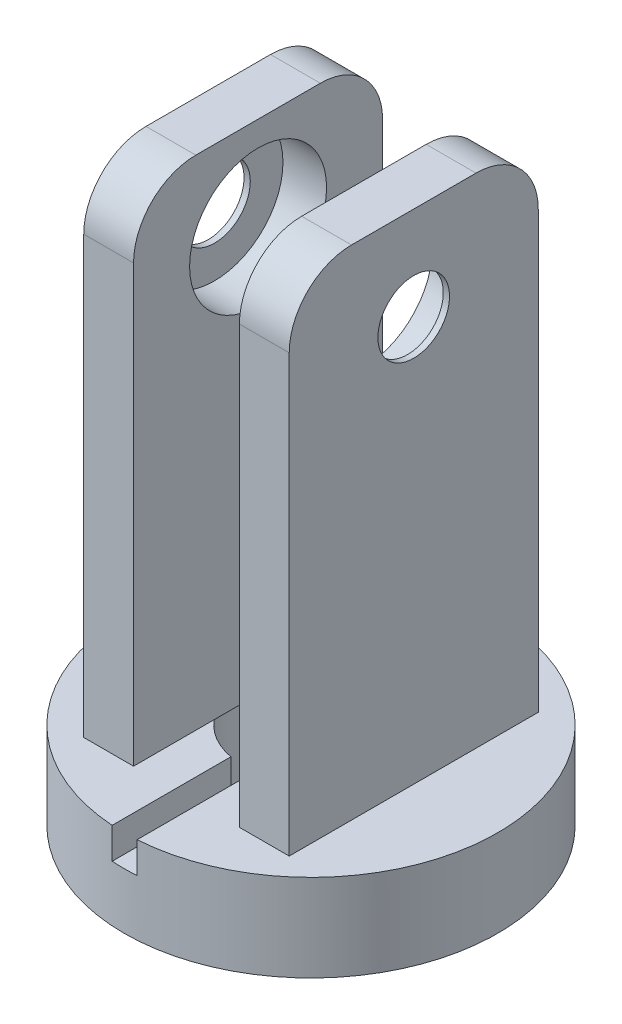
ISO-10303-21;
HEADER;
FILE_DESCRIPTION(('STEP AP214'),'2;1');
FILE_NAME('part.step','',(''),(''),'','','');
FILE_SCHEMA(('AUTOMOTIVE_DESIGN { 1 0 10303 214 1 1 1 1 }'));
ENDSEC;
DATA;
#1=APPLICATION_CONTEXT('core data for automotive mechanical design processes');
#2=APPLICATION_PROTOCOL_DEFINITION('international standard','automotive_design',2000,#1);
#3=PRODUCT_CONTEXT('',#1,'mechanical');
#4=PRODUCT('Part','Part','',(#3));
#5=PRODUCT_RELATED_PRODUCT_CATEGORY('part','',(#4));
#6=PRODUCT_DEFINITION_FORMATION('','',#4);
#7=PRODUCT_DEFINITION_CONTEXT('part definition',#1,'design');
#8=PRODUCT_DEFINITION('design','',#6,#7);
#9=PRODUCT_DEFINITION_SHAPE('','',#8);
#10=(LENGTH_UNIT() NAMED_UNIT(*) SI_UNIT(.MILLI.,.METRE.));
#11=(NAMED_UNIT(*) PLANE_ANGLE_UNIT() SI_UNIT($,.RADIAN.));
#12=(NAMED_UNIT(*) SI_UNIT($,.STERADIAN.) SOLID_ANGLE_UNIT());
#13=UNCERTAINTY_MEASURE_WITH_UNIT(LENGTH_MEASURE(1.E-05),#10,'distance_accuracy_value','');
#14=(GEOMETRIC_REPRESENTATION_CONTEXT(3) GLOBAL_UNCERTAINTY_ASSIGNED_CONTEXT((#13)) GLOBAL_UNIT_ASSIGNED_CONTEXT((#10,
#11,#12)) REPRESENTATION_CONTEXT('',''));
#15=CARTESIAN_POINT('',(0.,0.,0.));
#16=DIRECTION('',(0.,0.,1.));
#17=DIRECTION('',(1.,0.,0.));
#18=AXIS2_PLACEMENT_3D('',#15,#16,#17);
#19=CARTESIAN_POINT('',(0.,14.,0.));
#20=DIRECTION('',(0.,1.,0.));
#21=DIRECTION('',(0.,0.,1.));
#22=AXIS2_PLACEMENT_3D('',#19,#20,#21);
#23=PLANE('',#22);
#24=DIRECTION('',(0.,0.,-1.));
#25=VECTOR('',#24,1.);
#26=CARTESIAN_POINT('',(2.,14.,-29.9332590941915));
#27=LINE('',#26,#25);
#28=CARTESIAN_POINT('',(2.,14.,29.9332590941915));
#29=VERTEX_POINT('',#28);
#30=CARTESIAN_POINT('',(2.,14.,10.867497412008));
#31=VERTEX_POINT('',#30);
#32=EDGE_CURVE('E200',#29,#31,#27,.T.);
#33=ORIENTED_EDGE('',*,*,#32,.F.);
#34=CARTESIAN_POINT('',(0.,14.,0.));
#35=DIRECTION('',(0.,1.,0.));
#36=DIRECTION('',(0.,0.,1.));
#37=AXIS2_PLACEMENT_3D('',#34,#35,#36);
#38=CIRCLE('',#37,30.);
#39=CARTESIAN_POINT('',(2.,14.,-29.9332590941915));
#40=VERTEX_POINT('',#39);
#41=EDGE_CURVE('E282',#29,#40,#38,.T.);
#42=ORIENTED_EDGE('',*,*,#41,.T.);
#43=CARTESIAN_POINT('',(2.,14.,-10.867497412008));
#44=VERTEX_POINT('',#43);
#45=EDGE_CURVE('E354',#44,#40,#27,.T.);
#46=ORIENTED_EDGE('',*,*,#45,.F.);
#47=CARTESIAN_POINT('',(0.,14.,0.));
#48=DIRECTION('',(0.,-1.,0.));
#49=DIRECTION('',(0.,0.,-1.));
#50=AXIS2_PLACEMENT_3D('',#47,#48,#49);
#51=CIRCLE('',#50,11.05);
#52=CARTESIAN_POINT('',(8.5,14.,-7.06063028348037));
#53=VERTEX_POINT('',#52);
#54=EDGE_CURVE('E278',#44,#53,#51,.T.);
#55=ORIENTED_EDGE('',*,*,#54,.T.);
#56=DIRECTION('',(0.,0.,1.));
#57=VECTOR('',#56,1.);
#58=CARTESIAN_POINT('',(8.5,14.,-20.));
#59=LINE('',#58,#57);
#60=CARTESIAN_POINT('',(8.5,14.,-20.));
#61=VERTEX_POINT('',#60);
#62=EDGE_CURVE('E219',#61,#53,#59,.T.);
#63=ORIENTED_EDGE('',*,*,#62,.F.);
#64=DIRECTION('',(-1.,0.,0.));
#65=VECTOR('',#64,1.);
#66=CARTESIAN_POINT('',(16.5,14.,-20.));
#67=LINE('',#66,#65);
#68=CARTESIAN_POINT('',(16.5,14.,-20.));
#69=VERTEX_POINT('',#68);
#70=EDGE_CURVE('E230',#69,#61,#67,.T.);
#71=ORIENTED_EDGE('',*,*,#70,.F.);
#72=DIRECTION('',(0.,0.,-1.));
#73=VECTOR('',#72,1.);
#74=CARTESIAN_POINT('',(16.5,14.,20.));
#75=LINE('',#74,#73);
#76=CARTESIAN_POINT('',(16.5,14.,20.));
#77=VERTEX_POINT('',#76);
#78=EDGE_CURVE('E226',#77,#69,#75,.T.);
#79=ORIENTED_EDGE('',*,*,#78,.F.);
#80=DIRECTION('',(1.,0.,0.));
#81=VECTOR('',#80,1.);
#82=CARTESIAN_POINT('',(8.5,14.,20.));
#83=LINE('',#82,#81);
#84=CARTESIAN_POINT('',(8.5,14.,20.));
#85=VERTEX_POINT('',#84);
#86=EDGE_CURVE('E223',#85,#77,#83,.T.);
#87=ORIENTED_EDGE('',*,*,#86,.F.);
#88=CARTESIAN_POINT('',(8.5,14.,7.06063028348036));
#89=VERTEX_POINT('',#88);
#90=EDGE_CURVE('E233',#89,#85,#59,.T.);
#91=ORIENTED_EDGE('',*,*,#90,.F.);
#92=EDGE_CURVE('E366',#89,#31,#51,.T.);
#93=ORIENTED_EDGE('',*,*,#92,.T.);
#94=EDGE_LOOP('',(#33,#42,#46,#55,#63,#71,#79,#87,#91,#93));
#95=FACE_BOUND('',#94,.T.);
#96=ADVANCED_FACE('F34',(#95),#23,.T.);
#97=DIRECTION('',(0.,0.,1.));
#98=VECTOR('',#97,1.);
#99=CARTESIAN_POINT('',(-2.,14.,-29.9332590941915));
#100=LINE('',#99,#98);
#101=CARTESIAN_POINT('',(-2.,14.,-29.9332590941915));
#102=VERTEX_POINT('',#101);
#103=CARTESIAN_POINT('',(-2.,14.,-10.867497412008));
#104=VERTEX_POINT('',#103);
#105=EDGE_CURVE('E352',#102,#104,#100,.T.);
#106=ORIENTED_EDGE('',*,*,#105,.F.);
#107=CARTESIAN_POINT('',(-2.,14.,29.9332590941915));
#108=VERTEX_POINT('',#107);
#109=EDGE_CURVE('E207',#102,#108,#38,.T.);
#110=ORIENTED_EDGE('',*,*,#109,.T.);
#111=CARTESIAN_POINT('',(-2.,14.,10.867497412008));
#112=VERTEX_POINT('',#111);
#113=EDGE_CURVE('E339',#112,#108,#100,.T.);
#114=ORIENTED_EDGE('',*,*,#113,.F.);
#115=CARTESIAN_POINT('',(-8.5,14.,7.06063028348037));
#116=VERTEX_POINT('',#115);
#117=EDGE_CURVE('E281',#112,#116,#51,.T.);
#118=ORIENTED_EDGE('',*,*,#117,.T.);
#119=DIRECTION('',(0.,0.,-1.));
#120=VECTOR('',#119,1.);
#121=CARTESIAN_POINT('',(-8.5,14.,20.));
#122=LINE('',#121,#120);
#123=CARTESIAN_POINT('',(-8.5,14.,20.));
#124=VERTEX_POINT('',#123);
#125=EDGE_CURVE('E256',#124,#116,#122,.T.);
#126=ORIENTED_EDGE('',*,*,#125,.F.);
#127=DIRECTION('',(1.,0.,0.));
#128=VECTOR('',#127,1.);
#129=CARTESIAN_POINT('',(-16.5,14.,20.));
#130=LINE('',#129,#128);
#131=CARTESIAN_POINT('',(-16.5,14.,20.));
#132=VERTEX_POINT('',#131);
#133=EDGE_CURVE('E244',#132,#124,#130,.T.);
#134=ORIENTED_EDGE('',*,*,#133,.F.);
#135=DIRECTION('',(0.,0.,1.));
#136=VECTOR('',#135,1.);
#137=CARTESIAN_POINT('',(-16.5,14.,-20.));
#138=LINE('',#137,#136);
#139=CARTESIAN_POINT('',(-16.5,14.,-20.));
#140=VERTEX_POINT('',#139);
#141=EDGE_CURVE('E249',#140,#132,#138,.T.);
#142=ORIENTED_EDGE('',*,*,#141,.F.);
#143=DIRECTION('',(-1.,0.,0.));
#144=VECTOR('',#143,1.);
#145=CARTESIAN_POINT('',(-8.5,14.,-20.));
#146=LINE('',#145,#144);
#147=CARTESIAN_POINT('',(-8.5,14.,-20.));
#148=VERTEX_POINT('',#147);
#149=EDGE_CURVE('E259',#148,#140,#146,.T.);
#150=ORIENTED_EDGE('',*,*,#149,.F.);
#151=CARTESIAN_POINT('',(-8.5,14.,-7.06063028348037));
#152=VERTEX_POINT('',#151);
#153=EDGE_CURVE('E260',#152,#148,#122,.T.);
#154=ORIENTED_EDGE('',*,*,#153,.F.);
#155=EDGE_CURVE('E277',#152,#104,#51,.T.);
#156=ORIENTED_EDGE('',*,*,#155,.T.);
#157=EDGE_LOOP('',(#106,#110,#114,#118,#126,#134,#142,#150,#154,#156));
#158=FACE_BOUND('',#157,.T.);
#159=ADVANCED_FACE('F384',(#158),#23,.T.);
#160=CARTESIAN_POINT('',(0.,14.,0.));
#161=DIRECTION('',(0.,-1.,0.));
#162=DIRECTION('',(0.,0.,-1.));
#163=AXIS2_PLACEMENT_3D('',#160,#161,#162);
#164=CYLINDRICAL_SURFACE('',#163,30.);
#165=CARTESIAN_POINT('',(0.,9.,0.));
#166=DIRECTION('',(0.,1.,0.));
#167=DIRECTION('',(0.,0.,1.));
#168=AXIS2_PLACEMENT_3D('',#165,#166,#167);
#169=CIRCLE('',#168,30.);
#170=CARTESIAN_POINT('',(2.,9.,-29.9332590941915));
#171=VERTEX_POINT('',#170);
#172=CARTESIAN_POINT('',(-2.,9.,-29.9332590941915));
#173=VERTEX_POINT('',#172);
#174=EDGE_CURVE('E193',#171,#173,#169,.T.);
#175=ORIENTED_EDGE('',*,*,#174,.F.);
#176=DIRECTION('',(0.,1.,0.));
#177=VECTOR('',#176,1.);
#178=CARTESIAN_POINT('',(2.,9.,-29.9332590941915));
#179=LINE('',#178,#177);
#180=EDGE_CURVE('E227',#171,#40,#179,.T.);
#181=ORIENTED_EDGE('',*,*,#180,.T.);
#182=ORIENTED_EDGE('',*,*,#41,.F.);
#183=DIRECTION('',(0.,1.,0.));
#184=VECTOR('',#183,1.);
#185=CARTESIAN_POINT('',(2.,9.,29.9332590941915));
#186=LINE('',#185,#184);
#187=CARTESIAN_POINT('',(2.,9.,29.9332590941915));
#188=VERTEX_POINT('',#187);
#189=EDGE_CURVE('E210',#188,#29,#186,.T.);
#190=ORIENTED_EDGE('',*,*,#189,.F.);
#191=CARTESIAN_POINT('',(0.,9.,0.));
#192=DIRECTION('',(0.,1.,0.));
#193=DIRECTION('',(0.,0.,1.));
#194=AXIS2_PLACEMENT_3D('',#191,#192,#193);
#195=CIRCLE('',#194,30.);
#196=CARTESIAN_POINT('',(-2.,9.,29.9332590941915));
#197=VERTEX_POINT('',#196);
#198=EDGE_CURVE('E189',#197,#188,#195,.T.);
#199=ORIENTED_EDGE('',*,*,#198,.F.);
#200=DIRECTION('',(0.,1.,0.));
#201=VECTOR('',#200,1.);
#202=CARTESIAN_POINT('',(-2.,9.,29.9332590941915));
#203=LINE('',#202,#201);
#204=EDGE_CURVE('E208',#197,#108,#203,.T.);
#205=ORIENTED_EDGE('',*,*,#204,.T.);
#206=ORIENTED_EDGE('',*,*,#109,.F.);
#207=DIRECTION('',(0.,1.,0.));
#208=VECTOR('',#207,1.);
#209=CARTESIAN_POINT('',(-2.,9.,-29.9332590941915));
#210=LINE('',#209,#208);
#211=EDGE_CURVE('E185',#173,#102,#210,.T.);
#212=ORIENTED_EDGE('',*,*,#211,.F.);
#213=EDGE_LOOP('',(#175,#181,#182,#190,#199,#205,#206,#212));
#214=FACE_BOUND('',#213,.T.);
#215=CARTESIAN_POINT('',(0.,0.,0.));
#216=DIRECTION('',(0.,1.,0.));
#217=DIRECTION('',(0.,0.,1.));
#218=AXIS2_PLACEMENT_3D('',#215,#216,#217);
#219=CIRCLE('',#218,30.);
#220=CARTESIAN_POINT('',(0.,0.,30.));
#221=VERTEX_POINT('',#220);
#222=EDGE_CURVE('E276',#221,#221,#219,.T.);
#223=ORIENTED_EDGE('',*,*,#222,.T.);
#224=EDGE_LOOP('',(#223));
#225=FACE_BOUND('',#224,.T.);
#226=ADVANCED_FACE('F203',(#214,#225),#164,.T.);
#227=CARTESIAN_POINT('',(0.,0.,0.));
#228=DIRECTION('',(0.,1.,0.));
#229=DIRECTION('',(0.,0.,1.));
#230=AXIS2_PLACEMENT_3D('',#227,#228,#229);
#231=PLANE('',#230);
#232=CARTESIAN_POINT('',(0.,0.,0.));
#233=DIRECTION('',(0.,-1.,0.));
#234=DIRECTION('',(0.,0.,-1.));
#235=AXIS2_PLACEMENT_3D('',#232,#233,#234);
#236=CIRCLE('',#235,11.05);
#237=CARTESIAN_POINT('',(0.,0.,-11.05));
#238=VERTEX_POINT('',#237);
#239=EDGE_CURVE('E272',#238,#238,#236,.T.);
#240=ORIENTED_EDGE('',*,*,#239,.F.);
#241=EDGE_LOOP('',(#240));
#242=FACE_BOUND('',#241,.T.);
#243=ORIENTED_EDGE('',*,*,#222,.F.);
#244=EDGE_LOOP('',(#243));
#245=FACE_BOUND('',#244,.T.);
#246=ADVANCED_FACE('F437',(#242,#245),#231,.F.);
#247=CARTESIAN_POINT('',(0.,14.,0.));
#248=DIRECTION('',(0.,-1.,0.));
#249=DIRECTION('',(0.,0.,-1.));
#250=AXIS2_PLACEMENT_3D('',#247,#248,#249);
#251=CYLINDRICAL_SURFACE('',#250,11.05);
#252=ORIENTED_EDGE('',*,*,#54,.F.);
#253=DIRECTION('',(0.,-1.,0.));
#254=VECTOR('',#253,1.);
#255=CARTESIAN_POINT('',(2.,14.,-10.867497412008));
#256=LINE('',#255,#254);
#257=CARTESIAN_POINT('',(2.,9.,-10.867497412008));
#258=VERTEX_POINT('',#257);
#259=EDGE_CURVE('E12',#44,#258,#256,.T.);
#260=ORIENTED_EDGE('',*,*,#259,.T.);
#261=CARTESIAN_POINT('',(0.,9.,0.));
#262=DIRECTION('',(0.,1.,0.));
#263=DIRECTION('',(0.,0.,1.));
#264=AXIS2_PLACEMENT_3D('',#261,#262,#263);
#265=CIRCLE('',#264,11.05);
#266=CARTESIAN_POINT('',(-2.,9.,-10.867497412008));
#267=VERTEX_POINT('',#266);
#268=EDGE_CURVE('E326',#267,#258,#265,.F.);
#269=ORIENTED_EDGE('',*,*,#268,.F.);
#270=DIRECTION('',(0.,-1.,0.));
#271=VECTOR('',#270,1.);
#272=CARTESIAN_POINT('',(-2.,14.,-10.867497412008));
#273=LINE('',#272,#271);
#274=EDGE_CURVE('E43',#267,#104,#273,.F.);
#275=ORIENTED_EDGE('',*,*,#274,.T.);
#276=ORIENTED_EDGE('',*,*,#155,.F.);
#277=EDGE_CURVE('E273',#116,#152,#51,.T.);
#278=ORIENTED_EDGE('',*,*,#277,.F.);
#279=ORIENTED_EDGE('',*,*,#117,.F.);
#280=DIRECTION('',(0.,-1.,0.));
#281=VECTOR('',#280,1.);
#282=CARTESIAN_POINT('',(-2.,14.,10.867497412008));
#283=LINE('',#282,#281);
#284=CARTESIAN_POINT('',(-2.,9.,10.867497412008));
#285=VERTEX_POINT('',#284);
#286=EDGE_CURVE('E325',#112,#285,#283,.T.);
#287=ORIENTED_EDGE('',*,*,#286,.T.);
#288=CARTESIAN_POINT('',(2.,9.,10.867497412008));
#289=VERTEX_POINT('',#288);
#290=EDGE_CURVE('E323',#289,#285,#265,.F.);
#291=ORIENTED_EDGE('',*,*,#290,.F.);
#292=DIRECTION('',(0.,-1.,0.));
#293=VECTOR('',#292,1.);
#294=CARTESIAN_POINT('',(2.,14.,10.867497412008));
#295=LINE('',#294,#293);
#296=EDGE_CURVE('E329',#289,#31,#295,.F.);
#297=ORIENTED_EDGE('',*,*,#296,.T.);
#298=ORIENTED_EDGE('',*,*,#92,.F.);
#299=EDGE_CURVE('E376',#53,#89,#51,.T.);
#300=ORIENTED_EDGE('',*,*,#299,.F.);
#301=EDGE_LOOP('',(#252,#260,#269,#275,#276,#278,#279,#287,#291,#297,#298,#300));
#302=FACE_BOUND('',#301,.T.);
#303=ORIENTED_EDGE('',*,*,#239,.T.);
#304=EDGE_LOOP('',(#303));
#305=FACE_BOUND('',#304,.T.);
#306=ADVANCED_FACE('F373',(#302,#305),#251,.F.);
#307=CARTESIAN_POINT('',(0.,14.,0.));
#308=DIRECTION('',(0.,1.,0.));
#309=DIRECTION('',(0.,0.,1.));
#310=AXIS2_PLACEMENT_3D('',#307,#308,#309);
#311=PLANE('',#310);
#312=EDGE_CURVE('E255',#116,#152,#122,.T.);
#313=ORIENTED_EDGE('',*,*,#312,.F.);
#314=ORIENTED_EDGE('',*,*,#277,.T.);
#315=EDGE_LOOP('',(#313,#314));
#316=FACE_BOUND('',#315,.T.);
#317=ADVANCED_FACE('F390',(#316),#311,.F.);
#318=CARTESIAN_POINT('',(-16.5,94.,20.));
#319=DIRECTION('',(0.,0.,-1.));
#320=DIRECTION('',(-1.,0.,0.));
#321=AXIS2_PLACEMENT_3D('',#318,#319,#320);
#322=PLANE('',#321);
#323=DIRECTION('',(0.,-1.,0.));
#324=VECTOR('',#323,1.);
#325=CARTESIAN_POINT('',(-8.5,94.,20.));
#326=LINE('',#325,#324);
#327=CARTESIAN_POINT('',(-8.5,84.,20.));
#328=VERTEX_POINT('',#327);
#329=EDGE_CURVE('E270',#328,#124,#326,.T.);
#330=ORIENTED_EDGE('',*,*,#329,.F.);
#331=DIRECTION('',(1.,0.,0.));
#332=VECTOR('',#331,1.);
#333=CARTESIAN_POINT('',(-16.5,84.,20.));
#334=LINE('',#333,#332);
#335=CARTESIAN_POINT('',(-16.5,84.,20.));
#336=VERTEX_POINT('',#335);
#337=EDGE_CURVE('E321',#328,#336,#334,.F.);
#338=ORIENTED_EDGE('',*,*,#337,.T.);
#339=DIRECTION('',(0.,-1.,0.));
#340=VECTOR('',#339,1.);
#341=CARTESIAN_POINT('',(-16.5,94.,20.));
#342=LINE('',#341,#340);
#343=EDGE_CURVE('E252',#336,#132,#342,.T.);
#344=ORIENTED_EDGE('',*,*,#343,.T.);
#345=ORIENTED_EDGE('',*,*,#133,.T.);
#346=EDGE_LOOP('',(#330,#338,#344,#345));
#347=FACE_BOUND('',#346,.T.);
#348=ADVANCED_FACE('F399',(#347),#322,.F.);
#349=CARTESIAN_POINT('',(-8.5,94.,20.));
#350=DIRECTION('',(-1.,0.,0.));
#351=DIRECTION('',(0.,0.,1.));
#352=AXIS2_PLACEMENT_3D('',#349,#350,#351);
#353=PLANE('',#352);
#354=CARTESIAN_POINT('',(-8.5,79.,0.));
#355=DIRECTION('',(-1.,0.,0.));
#356=DIRECTION('',(0.,0.,1.));
#357=AXIS2_PLACEMENT_3D('',#354,#355,#356);
#358=CIRCLE('',#357,11.);
#359=CARTESIAN_POINT('',(-8.5,79.,11.));
#360=VERTEX_POINT('',#359);
#361=EDGE_CURVE('E334',#360,#360,#358,.T.);
#362=ORIENTED_EDGE('',*,*,#361,.T.);
#363=EDGE_LOOP('',(#362));
#364=FACE_BOUND('',#363,.T.);
#365=DIRECTION('',(0.,-1.,0.));
#366=VECTOR('',#365,1.);
#367=CARTESIAN_POINT('',(-8.5,94.,-20.));
#368=LINE('',#367,#366);
#369=CARTESIAN_POINT('',(-8.5,84.,-20.));
#370=VERTEX_POINT('',#369);
#371=EDGE_CURVE('E268',#370,#148,#368,.T.);
#372=ORIENTED_EDGE('',*,*,#371,.F.);
#373=CARTESIAN_POINT('',(-8.5,84.,-10.));
#374=DIRECTION('',(-1.,0.,0.));
#375=DIRECTION('',(0.,0.,1.));
#376=AXIS2_PLACEMENT_3D('',#373,#374,#375);
#377=CIRCLE('',#376,10.);
#378=CARTESIAN_POINT('',(-8.5,94.,-10.));
#379=VERTEX_POINT('',#378);
#380=EDGE_CURVE('E301',#370,#379,#377,.F.);
#381=ORIENTED_EDGE('',*,*,#380,.T.);
#382=DIRECTION('',(0.,0.,-1.));
#383=VECTOR('',#382,1.);
#384=CARTESIAN_POINT('',(-8.5,94.,20.));
#385=LINE('',#384,#383);
#386=CARTESIAN_POINT('',(-8.5,94.,10.));
#387=VERTEX_POINT('',#386);
#388=EDGE_CURVE('E245',#387,#379,#385,.T.);
#389=ORIENTED_EDGE('',*,*,#388,.F.);
#390=CARTESIAN_POINT('',(-8.5,84.,10.));
#391=DIRECTION('',(-1.,0.,0.));
#392=DIRECTION('',(0.,0.,1.));
#393=AXIS2_PLACEMENT_3D('',#390,#391,#392);
#394=CIRCLE('',#393,10.);
#395=EDGE_CURVE('E299',#387,#328,#394,.F.);
#396=ORIENTED_EDGE('',*,*,#395,.T.);
#397=ORIENTED_EDGE('',*,*,#329,.T.);
#398=ORIENTED_EDGE('',*,*,#125,.T.);
#399=ORIENTED_EDGE('',*,*,#312,.T.);
#400=ORIENTED_EDGE('',*,*,#153,.T.);
#401=EDGE_LOOP('',(#372,#381,#389,#396,#397,#398,#399,#400));
#402=FACE_BOUND('',#401,.T.);
#403=ADVANCED_FACE('F394',(#364,#402),#353,.F.);
#404=CARTESIAN_POINT('',(-8.5,94.,-20.));
#405=DIRECTION('',(0.,0.,1.));
#406=DIRECTION('',(1.,0.,0.));
#407=AXIS2_PLACEMENT_3D('',#404,#405,#406);
#408=PLANE('',#407);
#409=DIRECTION('',(0.,-1.,0.));
#410=VECTOR('',#409,1.);
#411=CARTESIAN_POINT('',(-16.5,94.,-20.));
#412=LINE('',#411,#410);
#413=CARTESIAN_POINT('',(-16.5,84.,-20.));
#414=VERTEX_POINT('',#413);
#415=EDGE_CURVE('E266',#414,#140,#412,.T.);
#416=ORIENTED_EDGE('',*,*,#415,.F.);
#417=DIRECTION('',(-1.,0.,0.));
#418=VECTOR('',#417,1.);
#419=CARTESIAN_POINT('',(-8.5,84.,-20.));
#420=LINE('',#419,#418);
#421=EDGE_CURVE('E297',#414,#370,#420,.F.);
#422=ORIENTED_EDGE('',*,*,#421,.T.);
#423=ORIENTED_EDGE('',*,*,#371,.T.);
#424=ORIENTED_EDGE('',*,*,#149,.T.);
#425=EDGE_LOOP('',(#416,#422,#423,#424));
#426=FACE_BOUND('',#425,.T.);
#427=ADVANCED_FACE('F417',(#426),#408,.F.);
#428=CARTESIAN_POINT('',(-16.5,94.,-20.));
#429=DIRECTION('',(1.,0.,0.));
#430=DIRECTION('',(0.,0.,-1.));
#431=AXIS2_PLACEMENT_3D('',#428,#429,#430);
#432=PLANE('',#431);
#433=CARTESIAN_POINT('',(-16.5,79.,0.));
#434=DIRECTION('',(-1.,0.,0.));
#435=DIRECTION('',(0.,0.,1.));
#436=AXIS2_PLACEMENT_3D('',#433,#434,#435);
#437=CIRCLE('',#436,5.75);
#438=CARTESIAN_POINT('',(-16.5,79.,5.75));
#439=VERTEX_POINT('',#438);
#440=EDGE_CURVE('E730',#439,#439,#437,.T.);
#441=ORIENTED_EDGE('',*,*,#440,.F.);
#442=EDGE_LOOP('',(#441));
#443=FACE_BOUND('',#442,.T.);
#444=DIRECTION('',(0.,0.,1.));
#445=VECTOR('',#444,1.);
#446=CARTESIAN_POINT('',(-16.5,94.,-20.));
#447=LINE('',#446,#445);
#448=CARTESIAN_POINT('',(-16.5,94.,-10.));
#449=VERTEX_POINT('',#448);
#450=CARTESIAN_POINT('',(-16.5,94.,10.));
#451=VERTEX_POINT('',#450);
#452=EDGE_CURVE('E248',#449,#451,#447,.T.);
#453=ORIENTED_EDGE('',*,*,#452,.F.);
#454=CARTESIAN_POINT('',(-16.5,84.,-10.));
#455=DIRECTION('',(1.,0.,0.));
#456=DIRECTION('',(0.,0.,-1.));
#457=AXIS2_PLACEMENT_3D('',#454,#455,#456);
#458=CIRCLE('',#457,10.);
#459=EDGE_CURVE('E295',#449,#414,#458,.F.);
#460=ORIENTED_EDGE('',*,*,#459,.T.);
#461=ORIENTED_EDGE('',*,*,#415,.T.);
#462=ORIENTED_EDGE('',*,*,#141,.T.);
#463=ORIENTED_EDGE('',*,*,#343,.F.);
#464=CARTESIAN_POINT('',(-16.5,84.,10.));
#465=DIRECTION('',(1.,0.,0.));
#466=DIRECTION('',(0.,0.,-1.));
#467=AXIS2_PLACEMENT_3D('',#464,#465,#466);
#468=CIRCLE('',#467,10.);
#469=EDGE_CURVE('E293',#336,#451,#468,.F.);
#470=ORIENTED_EDGE('',*,*,#469,.T.);
#471=EDGE_LOOP('',(#453,#460,#461,#462,#463,#470));
#472=FACE_BOUND('',#471,.T.);
#473=ADVANCED_FACE('F406',(#443,#472),#432,.F.);
#474=CARTESIAN_POINT('',(0.,94.,0.));
#475=DIRECTION('',(0.,1.,0.));
#476=DIRECTION('',(0.,0.,1.));
#477=AXIS2_PLACEMENT_3D('',#474,#475,#476);
#478=PLANE('',#477);
#479=ORIENTED_EDGE('',*,*,#388,.T.);
#480=DIRECTION('',(-1.,0.,0.));
#481=VECTOR('',#480,1.);
#482=CARTESIAN_POINT('',(-16.5,94.,-10.));
#483=LINE('',#482,#481);
#484=EDGE_CURVE('E290',#379,#449,#483,.T.);
#485=ORIENTED_EDGE('',*,*,#484,.T.);
#486=ORIENTED_EDGE('',*,*,#452,.T.);
#487=DIRECTION('',(1.,0.,0.));
#488=VECTOR('',#487,1.);
#489=CARTESIAN_POINT('',(-8.5,94.,10.));
#490=LINE('',#489,#488);
#491=EDGE_CURVE('E287',#451,#387,#490,.T.);
#492=ORIENTED_EDGE('',*,*,#491,.T.);
#493=EDGE_LOOP('',(#479,#485,#486,#492));
#494=FACE_BOUND('',#493,.T.);
#495=ADVANCED_FACE('F408',(#494),#478,.T.);
#496=CARTESIAN_POINT('',(0.,14.,0.));
#497=DIRECTION('',(0.,1.,0.));
#498=DIRECTION('',(0.,0.,1.));
#499=AXIS2_PLACEMENT_3D('',#496,#497,#498);
#500=PLANE('',#499);
#501=EDGE_CURVE('E236',#53,#89,#59,.T.);
#502=ORIENTED_EDGE('',*,*,#501,.F.);
#503=ORIENTED_EDGE('',*,*,#299,.T.);
#504=EDGE_LOOP('',(#502,#503));
#505=FACE_BOUND('',#504,.T.);
#506=ADVANCED_FACE('F483',(#505),#500,.F.);
#507=CARTESIAN_POINT('',(8.5,94.,20.));
#508=DIRECTION('',(0.,0.,-1.));
#509=DIRECTION('',(-1.,0.,0.));
#510=AXIS2_PLACEMENT_3D('',#507,#508,#509);
#511=PLANE('',#510);
#512=DIRECTION('',(0.,-1.,0.));
#513=VECTOR('',#512,1.);
#514=CARTESIAN_POINT('',(16.5,94.,20.));
#515=LINE('',#514,#513);
#516=CARTESIAN_POINT('',(16.5,84.,20.));
#517=VERTEX_POINT('',#516);
#518=EDGE_CURVE('E242',#517,#77,#515,.T.);
#519=ORIENTED_EDGE('',*,*,#518,.F.);
#520=DIRECTION('',(1.,0.,0.));
#521=VECTOR('',#520,1.);
#522=CARTESIAN_POINT('',(8.5,84.,20.));
#523=LINE('',#522,#521);
#524=CARTESIAN_POINT('',(8.5,84.,20.));
#525=VERTEX_POINT('',#524);
#526=EDGE_CURVE('E319',#517,#525,#523,.F.);
#527=ORIENTED_EDGE('',*,*,#526,.T.);
#528=DIRECTION('',(0.,-1.,0.));
#529=VECTOR('',#528,1.);
#530=CARTESIAN_POINT('',(8.5,94.,20.));
#531=LINE('',#530,#529);
#532=EDGE_CURVE('E222',#525,#85,#531,.T.);
#533=ORIENTED_EDGE('',*,*,#532,.T.);
#534=ORIENTED_EDGE('',*,*,#86,.T.);
#535=EDGE_LOOP('',(#519,#527,#533,#534));
#536=FACE_BOUND('',#535,.T.);
#537=ADVANCED_FACE('F480',(#536),#511,.F.);
#538=CARTESIAN_POINT('',(16.5,94.,20.));
#539=DIRECTION('',(-1.,0.,0.));
#540=DIRECTION('',(0.,0.,1.));
#541=AXIS2_PLACEMENT_3D('',#538,#539,#540);
#542=PLANE('',#541);
#543=CARTESIAN_POINT('',(16.5,79.,0.));
#544=DIRECTION('',(-1.,0.,0.));
#545=DIRECTION('',(0.,0.,1.));
#546=AXIS2_PLACEMENT_3D('',#543,#544,#545);
#547=CIRCLE('',#546,5.75);
#548=CARTESIAN_POINT('',(16.5,79.,5.75));
#549=VERTEX_POINT('',#548);
#550=EDGE_CURVE('E729',#549,#549,#547,.F.);
#551=ORIENTED_EDGE('',*,*,#550,.F.);
#552=EDGE_LOOP('',(#551));
#553=FACE_BOUND('',#552,.T.);
#554=DIRECTION('',(0.,-1.,0.));
#555=VECTOR('',#554,1.);
#556=CARTESIAN_POINT('',(16.5,94.,-20.));
#557=LINE('',#556,#555);
#558=CARTESIAN_POINT('',(16.5,84.,-20.));
#559=VERTEX_POINT('',#558);
#560=EDGE_CURVE('E240',#559,#69,#557,.T.);
#561=ORIENTED_EDGE('',*,*,#560,.F.);
#562=CARTESIAN_POINT('',(16.5,84.,-10.));
#563=DIRECTION('',(-1.,0.,0.));
#564=DIRECTION('',(0.,0.,1.));
#565=AXIS2_PLACEMENT_3D('',#562,#563,#564);
#566=CIRCLE('',#565,10.);
#567=CARTESIAN_POINT('',(16.5,94.,-9.99999999999999));
#568=VERTEX_POINT('',#567);
#569=EDGE_CURVE('E317',#559,#568,#566,.F.);
#570=ORIENTED_EDGE('',*,*,#569,.T.);
#571=DIRECTION('',(0.,0.,-1.));
#572=VECTOR('',#571,1.);
#573=CARTESIAN_POINT('',(16.5,94.,20.));
#574=LINE('',#573,#572);
#575=CARTESIAN_POINT('',(16.5,94.,10.));
#576=VERTEX_POINT('',#575);
#577=EDGE_CURVE('E215',#576,#568,#574,.T.);
#578=ORIENTED_EDGE('',*,*,#577,.F.);
#579=CARTESIAN_POINT('',(16.5,84.,10.));
#580=DIRECTION('',(-1.,0.,0.));
#581=DIRECTION('',(0.,0.,1.));
#582=AXIS2_PLACEMENT_3D('',#579,#580,#581);
#583=CIRCLE('',#582,10.);
#584=EDGE_CURVE('E315',#576,#517,#583,.F.);
#585=ORIENTED_EDGE('',*,*,#584,.T.);
#586=ORIENTED_EDGE('',*,*,#518,.T.);
#587=ORIENTED_EDGE('',*,*,#78,.T.);
#588=EDGE_LOOP('',(#561,#570,#578,#585,#586,#587));
#589=FACE_BOUND('',#588,.T.);
#590=ADVANCED_FACE('F477',(#553,#589),#542,.F.);
#591=CARTESIAN_POINT('',(16.5,94.,-20.));
#592=DIRECTION('',(0.,0.,1.));
#593=DIRECTION('',(1.,0.,0.));
#594=AXIS2_PLACEMENT_3D('',#591,#592,#593);
#595=PLANE('',#594);
#596=DIRECTION('',(0.,-1.,0.));
#597=VECTOR('',#596,1.);
#598=CARTESIAN_POINT('',(8.5,94.,-20.));
#599=LINE('',#598,#597);
#600=CARTESIAN_POINT('',(8.5,84.,-20.));
#601=VERTEX_POINT('',#600);
#602=EDGE_CURVE('E238',#601,#61,#599,.T.);
#603=ORIENTED_EDGE('',*,*,#602,.F.);
#604=DIRECTION('',(-1.,0.,0.));
#605=VECTOR('',#604,1.);
#606=CARTESIAN_POINT('',(16.5,84.,-20.));
#607=LINE('',#606,#605);
#608=EDGE_CURVE('E313',#601,#559,#607,.F.);
#609=ORIENTED_EDGE('',*,*,#608,.T.);
#610=ORIENTED_EDGE('',*,*,#560,.T.);
#611=ORIENTED_EDGE('',*,*,#70,.T.);
#612=EDGE_LOOP('',(#603,#609,#610,#611));
#613=FACE_BOUND('',#612,.T.);
#614=ADVANCED_FACE('F471',(#613),#595,.F.);
#615=CARTESIAN_POINT('',(8.5,94.,-20.));
#616=DIRECTION('',(1.,0.,0.));
#617=DIRECTION('',(0.,0.,-1.));
#618=AXIS2_PLACEMENT_3D('',#615,#616,#617);
#619=PLANE('',#618);
#620=CARTESIAN_POINT('',(8.5,79.,0.));
#621=DIRECTION('',(1.,0.,0.));
#622=DIRECTION('',(0.,0.,-1.));
#623=AXIS2_PLACEMENT_3D('',#620,#621,#622);
#624=CIRCLE('',#623,11.);
#625=CARTESIAN_POINT('',(8.5,79.,-11.));
#626=VERTEX_POINT('',#625);
#627=EDGE_CURVE('E332',#626,#626,#624,.T.);
#628=ORIENTED_EDGE('',*,*,#627,.T.);
#629=EDGE_LOOP('',(#628));
#630=FACE_BOUND('',#629,.T.);
#631=DIRECTION('',(0.,0.,1.));
#632=VECTOR('',#631,1.);
#633=CARTESIAN_POINT('',(8.5,94.,-20.));
#634=LINE('',#633,#632);
#635=CARTESIAN_POINT('',(8.5,94.,-10.));
#636=VERTEX_POINT('',#635);
#637=CARTESIAN_POINT('',(8.5,94.,10.));
#638=VERTEX_POINT('',#637);
#639=EDGE_CURVE('E218',#636,#638,#634,.T.);
#640=ORIENTED_EDGE('',*,*,#639,.F.);
#641=CARTESIAN_POINT('',(8.5,84.,-10.));
#642=DIRECTION('',(1.,0.,0.));
#643=DIRECTION('',(0.,0.,-1.));
#644=AXIS2_PLACEMENT_3D('',#641,#642,#643);
#645=CIRCLE('',#644,10.);
#646=EDGE_CURVE('E311',#636,#601,#645,.F.);
#647=ORIENTED_EDGE('',*,*,#646,.T.);
#648=ORIENTED_EDGE('',*,*,#602,.T.);
#649=ORIENTED_EDGE('',*,*,#62,.T.);
#650=ORIENTED_EDGE('',*,*,#501,.T.);
#651=ORIENTED_EDGE('',*,*,#90,.T.);
#652=ORIENTED_EDGE('',*,*,#532,.F.);
#653=CARTESIAN_POINT('',(8.5,84.,10.));
#654=DIRECTION('',(1.,0.,0.));
#655=DIRECTION('',(0.,0.,-1.));
#656=AXIS2_PLACEMENT_3D('',#653,#654,#655);
#657=CIRCLE('',#656,10.);
#658=EDGE_CURVE('E309',#525,#638,#657,.F.);
#659=ORIENTED_EDGE('',*,*,#658,.T.);
#660=EDGE_LOOP('',(#640,#647,#648,#649,#650,#651,#652,#659));
#661=FACE_BOUND('',#660,.T.);
#662=ADVANCED_FACE('F462',(#630,#661),#619,.F.);
#663=CARTESIAN_POINT('',(0.,94.,0.));
#664=DIRECTION('',(0.,1.,0.));
#665=DIRECTION('',(0.,0.,1.));
#666=AXIS2_PLACEMENT_3D('',#663,#664,#665);
#667=PLANE('',#666);
#668=ORIENTED_EDGE('',*,*,#577,.T.);
#669=DIRECTION('',(-1.,0.,0.));
#670=VECTOR('',#669,1.);
#671=CARTESIAN_POINT('',(8.49999999999999,94.,-10.));
#672=LINE('',#671,#670);
#673=EDGE_CURVE('E306',#568,#636,#672,.T.);
#674=ORIENTED_EDGE('',*,*,#673,.T.);
#675=ORIENTED_EDGE('',*,*,#639,.T.);
#676=DIRECTION('',(1.,0.,0.));
#677=VECTOR('',#676,1.);
#678=CARTESIAN_POINT('',(16.5,94.,10.));
#679=LINE('',#678,#677);
#680=EDGE_CURVE('E303',#638,#576,#679,.T.);
#681=ORIENTED_EDGE('',*,*,#680,.T.);
#682=EDGE_LOOP('',(#668,#674,#675,#681));
#683=FACE_BOUND('',#682,.T.);
#684=ADVANCED_FACE('F446',(#683),#667,.T.);
#685=CARTESIAN_POINT('',(0.,84.,-10.));
#686=DIRECTION('',(1.,0.,0.));
#687=DIRECTION('',(0.,0.,-1.));
#688=AXIS2_PLACEMENT_3D('',#685,#686,#687);
#689=CYLINDRICAL_SURFACE('',#688,10.);
#690=ORIENTED_EDGE('',*,*,#380,.F.);
#691=ORIENTED_EDGE('',*,*,#421,.F.);
#692=ORIENTED_EDGE('',*,*,#459,.F.);
#693=ORIENTED_EDGE('',*,*,#484,.F.);
#694=EDGE_LOOP('',(#690,#691,#692,#693));
#695=FACE_BOUND('',#694,.T.);
#696=ADVANCED_FACE('F412',(#695),#689,.T.);
#697=CARTESIAN_POINT('',(0.,84.,-10.));
#698=DIRECTION('',(1.,0.,0.));
#699=DIRECTION('',(0.,0.,-1.));
#700=AXIS2_PLACEMENT_3D('',#697,#698,#699);
#701=CYLINDRICAL_SURFACE('',#700,10.);
#702=ORIENTED_EDGE('',*,*,#569,.F.);
#703=ORIENTED_EDGE('',*,*,#608,.F.);
#704=ORIENTED_EDGE('',*,*,#646,.F.);
#705=ORIENTED_EDGE('',*,*,#673,.F.);
#706=EDGE_LOOP('',(#702,#703,#704,#705));
#707=FACE_BOUND('',#706,.T.);
#708=ADVANCED_FACE('F445',(#707),#701,.T.);
#709=CARTESIAN_POINT('',(0.,84.,10.));
#710=DIRECTION('',(-1.,0.,0.));
#711=DIRECTION('',(0.,0.,1.));
#712=AXIS2_PLACEMENT_3D('',#709,#710,#711);
#713=CYLINDRICAL_SURFACE('',#712,10.);
#714=ORIENTED_EDGE('',*,*,#658,.F.);
#715=ORIENTED_EDGE('',*,*,#526,.F.);
#716=ORIENTED_EDGE('',*,*,#584,.F.);
#717=ORIENTED_EDGE('',*,*,#680,.F.);
#718=EDGE_LOOP('',(#714,#715,#716,#717));
#719=FACE_BOUND('',#718,.T.);
#720=ADVANCED_FACE('F448',(#719),#713,.T.);
#721=CARTESIAN_POINT('',(0.,84.,10.));
#722=DIRECTION('',(-1.,0.,0.));
#723=DIRECTION('',(0.,0.,1.));
#724=AXIS2_PLACEMENT_3D('',#721,#722,#723);
#725=CYLINDRICAL_SURFACE('',#724,10.);
#726=ORIENTED_EDGE('',*,*,#469,.F.);
#727=ORIENTED_EDGE('',*,*,#337,.F.);
#728=ORIENTED_EDGE('',*,*,#395,.F.);
#729=ORIENTED_EDGE('',*,*,#491,.F.);
#730=EDGE_LOOP('',(#726,#727,#728,#729));
#731=FACE_BOUND('',#730,.T.);
#732=ADVANCED_FACE('F36',(#731),#725,.T.);
#733=CARTESIAN_POINT('',(0.,9.,0.));
#734=DIRECTION('',(0.,1.,0.));
#735=DIRECTION('',(0.,0.,1.));
#736=AXIS2_PLACEMENT_3D('',#733,#734,#735);
#737=PLANE('',#736);
#738=ORIENTED_EDGE('',*,*,#290,.T.);
#739=DIRECTION('',(0.,0.,1.));
#740=VECTOR('',#739,1.);
#741=CARTESIAN_POINT('',(-2.,9.,-29.9332590941915));
#742=LINE('',#741,#740);
#743=EDGE_CURVE('E190',#285,#197,#742,.T.);
#744=ORIENTED_EDGE('',*,*,#743,.T.);
#745=ORIENTED_EDGE('',*,*,#198,.T.);
#746=DIRECTION('',(0.,0.,-1.));
#747=VECTOR('',#746,1.);
#748=CARTESIAN_POINT('',(2.,9.,-29.9332590941915));
#749=LINE('',#748,#747);
#750=EDGE_CURVE('E59',#188,#289,#749,.T.);
#751=ORIENTED_EDGE('',*,*,#750,.T.);
#752=EDGE_LOOP('',(#738,#744,#745,#751));
#753=FACE_BOUND('',#752,.T.);
#754=ADVANCED_FACE('F455',(#753),#737,.T.);
#755=CARTESIAN_POINT('',(-2.,9.,-29.9332590941915));
#756=DIRECTION('',(-1.,0.,0.));
#757=DIRECTION('',(0.,0.,1.));
#758=AXIS2_PLACEMENT_3D('',#755,#756,#757);
#759=PLANE('',#758);
#760=ORIENTED_EDGE('',*,*,#113,.T.);
#761=ORIENTED_EDGE('',*,*,#204,.F.);
#762=ORIENTED_EDGE('',*,*,#743,.F.);
#763=ORIENTED_EDGE('',*,*,#286,.F.);
#764=EDGE_LOOP('',(#760,#761,#762,#763));
#765=FACE_BOUND('',#764,.T.);
#766=ADVANCED_FACE('F688',(#765),#759,.F.);
#767=CARTESIAN_POINT('',(2.,9.,-29.9332590941915));
#768=DIRECTION('',(1.,0.,0.));
#769=DIRECTION('',(0.,0.,-1.));
#770=AXIS2_PLACEMENT_3D('',#767,#768,#769);
#771=PLANE('',#770);
#772=ORIENTED_EDGE('',*,*,#750,.F.);
#773=ORIENTED_EDGE('',*,*,#189,.T.);
#774=ORIENTED_EDGE('',*,*,#32,.T.);
#775=ORIENTED_EDGE('',*,*,#296,.F.);
#776=EDGE_LOOP('',(#772,#773,#774,#775));
#777=FACE_BOUND('',#776,.T.);
#778=ADVANCED_FACE('F359',(#777),#771,.F.);
#779=ORIENTED_EDGE('',*,*,#45,.T.);
#780=ORIENTED_EDGE('',*,*,#180,.F.);
#781=EDGE_CURVE('E196',#258,#171,#749,.T.);
#782=ORIENTED_EDGE('',*,*,#781,.F.);
#783=ORIENTED_EDGE('',*,*,#259,.F.);
#784=EDGE_LOOP('',(#779,#780,#782,#783));
#785=FACE_BOUND('',#784,.T.);
#786=ADVANCED_FACE('F368',(#785),#771,.F.);
#787=EDGE_CURVE('E51',#173,#267,#742,.T.);
#788=ORIENTED_EDGE('',*,*,#787,.F.);
#789=ORIENTED_EDGE('',*,*,#211,.T.);
#790=ORIENTED_EDGE('',*,*,#105,.T.);
#791=ORIENTED_EDGE('',*,*,#274,.F.);
#792=EDGE_LOOP('',(#788,#789,#790,#791));
#793=FACE_BOUND('',#792,.T.);
#794=ADVANCED_FACE('F183',(#793),#759,.F.);
#795=ORIENTED_EDGE('',*,*,#268,.T.);
#796=ORIENTED_EDGE('',*,*,#781,.T.);
#797=ORIENTED_EDGE('',*,*,#174,.T.);
#798=ORIENTED_EDGE('',*,*,#787,.T.);
#799=EDGE_LOOP('',(#795,#796,#797,#798));
#800=FACE_BOUND('',#799,.T.);
#801=ADVANCED_FACE('F194',(#800),#737,.T.);
#802=CARTESIAN_POINT('',(15.5,94.,20.));
#803=DIRECTION('',(-1.,0.,0.));
#804=DIRECTION('',(0.,0.,1.));
#805=AXIS2_PLACEMENT_3D('',#802,#803,#804);
#806=PLANE('',#805);
#807=CARTESIAN_POINT('',(15.5,79.,0.));
#808=DIRECTION('',(-1.,0.,0.));
#809=DIRECTION('',(0.,0.,1.));
#810=AXIS2_PLACEMENT_3D('',#807,#808,#809);
#811=CIRCLE('',#810,5.75);
#812=CARTESIAN_POINT('',(15.5,79.,5.75));
#813=VERTEX_POINT('',#812);
#814=EDGE_CURVE('E347',#813,#813,#811,.T.);
#815=ORIENTED_EDGE('',*,*,#814,.F.);
#816=EDGE_LOOP('',(#815));
#817=FACE_BOUND('',#816,.T.);
#818=CARTESIAN_POINT('',(15.5,79.,0.));
#819=DIRECTION('',(-1.,0.,0.));
#820=DIRECTION('',(0.,0.,1.));
#821=AXIS2_PLACEMENT_3D('',#818,#819,#820);
#822=CIRCLE('',#821,11.);
#823=CARTESIAN_POINT('',(15.5,79.,11.));
#824=VERTEX_POINT('',#823);
#825=EDGE_CURVE('E342',#824,#824,#822,.T.);
#826=ORIENTED_EDGE('',*,*,#825,.T.);
#827=EDGE_LOOP('',(#826));
#828=FACE_BOUND('',#827,.T.);
#829=ADVANCED_FACE('F623',(#817,#828),#806,.T.);
#830=CARTESIAN_POINT('',(-47.6126983722081,79.,0.));
#831=DIRECTION('',(1.,0.,0.));
#832=DIRECTION('',(0.,0.,-1.));
#833=AXIS2_PLACEMENT_3D('',#830,#831,#832);
#834=CYLINDRICAL_SURFACE('',#833,11.);
#835=ORIENTED_EDGE('',*,*,#825,.F.);
#836=EDGE_LOOP('',(#835));
#837=FACE_BOUND('',#836,.T.);
#838=ORIENTED_EDGE('',*,*,#627,.F.);
#839=EDGE_LOOP('',(#838));
#840=FACE_BOUND('',#839,.T.);
#841=ADVANCED_FACE('F617',(#837,#840),#834,.F.);
#842=CARTESIAN_POINT('',(-15.5,79.,0.));
#843=DIRECTION('',(1.,0.,0.));
#844=DIRECTION('',(0.,0.,-1.));
#845=AXIS2_PLACEMENT_3D('',#842,#843,#844);
#846=CIRCLE('',#845,11.);
#847=CARTESIAN_POINT('',(-15.5,79.,-11.));
#848=VERTEX_POINT('',#847);
#849=EDGE_CURVE('E335',#848,#848,#846,.F.);
#850=ORIENTED_EDGE('',*,*,#849,.T.);
#851=EDGE_LOOP('',(#850));
#852=FACE_BOUND('',#851,.T.);
#853=ORIENTED_EDGE('',*,*,#361,.F.);
#854=EDGE_LOOP('',(#853));
#855=FACE_BOUND('',#854,.T.);
#856=ADVANCED_FACE('F622',(#852,#855),#834,.F.);
#857=CARTESIAN_POINT('',(-15.5,94.,-20.));
#858=DIRECTION('',(1.,0.,0.));
#859=DIRECTION('',(0.,0.,-1.));
#860=AXIS2_PLACEMENT_3D('',#857,#858,#859);
#861=PLANE('',#860);
#862=CARTESIAN_POINT('',(-15.5,79.,0.));
#863=DIRECTION('',(1.,0.,0.));
#864=DIRECTION('',(0.,0.,-1.));
#865=AXIS2_PLACEMENT_3D('',#862,#863,#864);
#866=CIRCLE('',#865,5.75);
#867=CARTESIAN_POINT('',(-15.5,79.,-5.75));
#868=VERTEX_POINT('',#867);
#869=EDGE_CURVE('E38',#868,#868,#866,.T.);
#870=ORIENTED_EDGE('',*,*,#869,.F.);
#871=EDGE_LOOP('',(#870));
#872=FACE_BOUND('',#871,.T.);
#873=ORIENTED_EDGE('',*,*,#849,.F.);
#874=EDGE_LOOP('',(#873));
#875=FACE_BOUND('',#874,.T.);
#876=ADVANCED_FACE('F635',(#872,#875),#861,.T.);
#877=CARTESIAN_POINT('',(32.7634559672906,79.,0.));
#878=DIRECTION('',(-1.,0.,0.));
#879=DIRECTION('',(0.,0.,1.));
#880=AXIS2_PLACEMENT_3D('',#877,#878,#879);
#881=CYLINDRICAL_SURFACE('',#880,5.75);
#882=ORIENTED_EDGE('',*,*,#869,.T.);
#883=EDGE_LOOP('',(#882));
#884=FACE_BOUND('',#883,.T.);
#885=ORIENTED_EDGE('',*,*,#440,.T.);
#886=EDGE_LOOP('',(#885));
#887=FACE_BOUND('',#886,.T.);
#888=ADVANCED_FACE('F660',(#884,#887),#881,.F.);
#889=ORIENTED_EDGE('',*,*,#814,.T.);
#890=EDGE_LOOP('',(#889));
#891=FACE_BOUND('',#890,.T.);
#892=ORIENTED_EDGE('',*,*,#550,.T.);
#893=EDGE_LOOP('',(#892));
#894=FACE_BOUND('',#893,.T.);
#895=ADVANCED_FACE('F670',(#891,#894),#881,.F.);
#896=CLOSED_SHELL('',(#96,#159,#226,#246,#306,#317,#348,#403,#427,#473,#495,#506,#537,#590,#614,
#662,#684,#696,#708,#720,#732,#754,#766,#778,#786,#794,#801,#829,#841,#856,#876,#888,#895));
#897=MANIFOLD_SOLID_BREP('B2',#896);
#898=ADVANCED_BREP_SHAPE_REPRESENTATION('',(#18,#897),#14);
#899=SHAPE_DEFINITION_REPRESENTATION(#9,#898);
ENDSEC;
END-ISO-10303-21;
